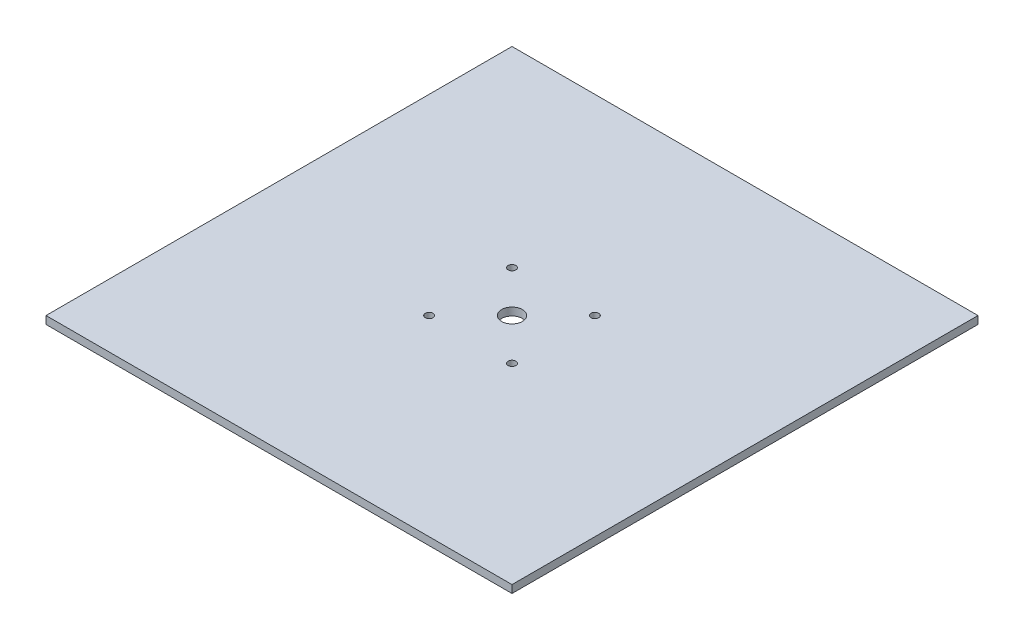
ISO-10303-21;
HEADER;
FILE_DESCRIPTION(('STEP AP214'),'2;1');
FILE_NAME('part.step','',(''),(''),'','','');
FILE_SCHEMA(('AUTOMOTIVE_DESIGN { 1 0 10303 214 1 1 1 1 }'));
ENDSEC;
DATA;
#1=APPLICATION_CONTEXT('core data for automotive mechanical design processes');
#2=APPLICATION_PROTOCOL_DEFINITION('international standard','automotive_design',2000,#1);
#3=PRODUCT_CONTEXT('',#1,'mechanical');
#4=PRODUCT('Part','Part','',(#3));
#5=PRODUCT_RELATED_PRODUCT_CATEGORY('part','',(#4));
#6=PRODUCT_DEFINITION_FORMATION('','',#4);
#7=PRODUCT_DEFINITION_CONTEXT('part definition',#1,'design');
#8=PRODUCT_DEFINITION('design','',#6,#7);
#9=PRODUCT_DEFINITION_SHAPE('','',#8);
#10=(LENGTH_UNIT() NAMED_UNIT(*) SI_UNIT(.MILLI.,.METRE.));
#11=(NAMED_UNIT(*) PLANE_ANGLE_UNIT() SI_UNIT($,.RADIAN.));
#12=(NAMED_UNIT(*) SI_UNIT($,.STERADIAN.) SOLID_ANGLE_UNIT());
#13=UNCERTAINTY_MEASURE_WITH_UNIT(LENGTH_MEASURE(1.E-05),#10,'distance_accuracy_value','');
#14=(GEOMETRIC_REPRESENTATION_CONTEXT(3) GLOBAL_UNCERTAINTY_ASSIGNED_CONTEXT((#13)) GLOBAL_UNIT_ASSIGNED_CONTEXT((#10,
#11,#12)) REPRESENTATION_CONTEXT('',''));
#15=CARTESIAN_POINT('',(0.,0.,0.));
#16=DIRECTION('',(0.,0.,1.));
#17=DIRECTION('',(1.,0.,0.));
#18=AXIS2_PLACEMENT_3D('',#15,#16,#17);
#19=CARTESIAN_POINT('',(90.,3.,90.));
#20=DIRECTION('',(-1.,0.,0.));
#21=DIRECTION('',(0.,0.,1.));
#22=AXIS2_PLACEMENT_3D('',#19,#20,#21);
#23=PLANE('',#22);
#24=DIRECTION('',(0.,0.,-1.));
#25=VECTOR('',#24,1.);
#26=CARTESIAN_POINT('',(90.,0.,90.));
#27=LINE('',#26,#25);
#28=CARTESIAN_POINT('',(90.,0.,90.));
#29=VERTEX_POINT('',#28);
#30=CARTESIAN_POINT('',(90.,0.,-90.));
#31=VERTEX_POINT('',#30);
#32=EDGE_CURVE('E107',#29,#31,#27,.T.);
#33=ORIENTED_EDGE('',*,*,#32,.T.);
#34=DIRECTION('',(0.,-1.,0.));
#35=VECTOR('',#34,1.);
#36=CARTESIAN_POINT('',(90.,3.,-90.));
#37=LINE('',#36,#35);
#38=CARTESIAN_POINT('',(90.,3.,-90.));
#39=VERTEX_POINT('',#38);
#40=EDGE_CURVE('E11',#39,#31,#37,.T.);
#41=ORIENTED_EDGE('',*,*,#40,.F.);
#42=DIRECTION('',(0.,0.,-1.));
#43=VECTOR('',#42,1.);
#44=CARTESIAN_POINT('',(90.,3.,90.));
#45=LINE('',#44,#43);
#46=CARTESIAN_POINT('',(90.,3.,90.));
#47=VERTEX_POINT('',#46);
#48=EDGE_CURVE('E91',#47,#39,#45,.T.);
#49=ORIENTED_EDGE('',*,*,#48,.F.);
#50=DIRECTION('',(0.,-1.,0.));
#51=VECTOR('',#50,1.);
#52=CARTESIAN_POINT('',(90.,3.,90.));
#53=LINE('',#52,#51);
#54=EDGE_CURVE('E103',#47,#29,#53,.T.);
#55=ORIENTED_EDGE('',*,*,#54,.T.);
#56=EDGE_LOOP('',(#33,#41,#49,#55));
#57=FACE_BOUND('',#56,.T.);
#58=ADVANCED_FACE('F39',(#57),#23,.F.);
#59=CARTESIAN_POINT('',(-90.,3.,-90.));
#60=DIRECTION('',(0.,0.,1.));
#61=DIRECTION('',(1.,0.,0.));
#62=AXIS2_PLACEMENT_3D('',#59,#60,#61);
#63=PLANE('',#62);
#64=DIRECTION('',(-1.,0.,0.));
#65=VECTOR('',#64,1.);
#66=CARTESIAN_POINT('',(-90.,0.,-90.));
#67=LINE('',#66,#65);
#68=CARTESIAN_POINT('',(-90.,0.,-90.));
#69=VERTEX_POINT('',#68);
#70=EDGE_CURVE('E96',#31,#69,#67,.T.);
#71=ORIENTED_EDGE('',*,*,#70,.T.);
#72=DIRECTION('',(0.,-1.,0.));
#73=VECTOR('',#72,1.);
#74=CARTESIAN_POINT('',(-90.,3.,-90.));
#75=LINE('',#74,#73);
#76=CARTESIAN_POINT('',(-90.,3.,-90.));
#77=VERTEX_POINT('',#76);
#78=EDGE_CURVE('E48',#77,#69,#75,.T.);
#79=ORIENTED_EDGE('',*,*,#78,.F.);
#80=DIRECTION('',(-1.,0.,0.));
#81=VECTOR('',#80,1.);
#82=CARTESIAN_POINT('',(-90.,3.,-90.));
#83=LINE('',#82,#81);
#84=EDGE_CURVE('E86',#39,#77,#83,.T.);
#85=ORIENTED_EDGE('',*,*,#84,.F.);
#86=ORIENTED_EDGE('',*,*,#40,.T.);
#87=EDGE_LOOP('',(#71,#79,#85,#86));
#88=FACE_BOUND('',#87,.T.);
#89=ADVANCED_FACE('F95',(#88),#63,.F.);
#90=CARTESIAN_POINT('',(-90.,3.,90.));
#91=DIRECTION('',(1.,0.,0.));
#92=DIRECTION('',(0.,0.,-1.));
#93=AXIS2_PLACEMENT_3D('',#90,#91,#92);
#94=PLANE('',#93);
#95=DIRECTION('',(0.,0.,1.));
#96=VECTOR('',#95,1.);
#97=CARTESIAN_POINT('',(-90.,0.,90.));
#98=LINE('',#97,#96);
#99=CARTESIAN_POINT('',(-90.,0.,90.));
#100=VERTEX_POINT('',#99);
#101=EDGE_CURVE('E73',#69,#100,#98,.T.);
#102=ORIENTED_EDGE('',*,*,#101,.T.);
#103=DIRECTION('',(0.,-1.,0.));
#104=VECTOR('',#103,1.);
#105=CARTESIAN_POINT('',(-90.,3.,90.));
#106=LINE('',#105,#104);
#107=CARTESIAN_POINT('',(-90.,3.,90.));
#108=VERTEX_POINT('',#107);
#109=EDGE_CURVE('E98',#108,#100,#106,.T.);
#110=ORIENTED_EDGE('',*,*,#109,.F.);
#111=DIRECTION('',(0.,0.,1.));
#112=VECTOR('',#111,1.);
#113=CARTESIAN_POINT('',(-90.,3.,90.));
#114=LINE('',#113,#112);
#115=EDGE_CURVE('E89',#77,#108,#114,.T.);
#116=ORIENTED_EDGE('',*,*,#115,.F.);
#117=ORIENTED_EDGE('',*,*,#78,.T.);
#118=EDGE_LOOP('',(#102,#110,#116,#117));
#119=FACE_BOUND('',#118,.T.);
#120=ADVANCED_FACE('F99',(#119),#94,.F.);
#121=CARTESIAN_POINT('',(-90.,3.,90.));
#122=DIRECTION('',(0.,0.,-1.));
#123=DIRECTION('',(-1.,0.,0.));
#124=AXIS2_PLACEMENT_3D('',#121,#122,#123);
#125=PLANE('',#124);
#126=DIRECTION('',(1.,0.,0.));
#127=VECTOR('',#126,1.);
#128=CARTESIAN_POINT('',(-90.,0.,90.));
#129=LINE('',#128,#127);
#130=EDGE_CURVE('E79',#100,#29,#129,.T.);
#131=ORIENTED_EDGE('',*,*,#130,.T.);
#132=ORIENTED_EDGE('',*,*,#54,.F.);
#133=DIRECTION('',(1.,0.,0.));
#134=VECTOR('',#133,1.);
#135=CARTESIAN_POINT('',(-90.,3.,90.));
#136=LINE('',#135,#134);
#137=EDGE_CURVE('E56',#108,#47,#136,.T.);
#138=ORIENTED_EDGE('',*,*,#137,.F.);
#139=ORIENTED_EDGE('',*,*,#109,.T.);
#140=EDGE_LOOP('',(#131,#132,#138,#139));
#141=FACE_BOUND('',#140,.T.);
#142=ADVANCED_FACE('F121',(#141),#125,.F.);
#143=CARTESIAN_POINT('',(0.,3.,0.));
#144=DIRECTION('',(0.,-1.,0.));
#145=DIRECTION('',(0.,0.,-1.));
#146=AXIS2_PLACEMENT_3D('',#143,#144,#145);
#147=PLANE('',#146);
#148=CARTESIAN_POINT('',(-15.9999999999991,3.,16.));
#149=DIRECTION('',(0.,-1.,0.));
#150=DIRECTION('',(0.,0.,-1.));
#151=AXIS2_PLACEMENT_3D('',#148,#149,#150);
#152=CIRCLE('',#151,1.50000000000047);
#153=CARTESIAN_POINT('',(-15.9999999999991,3.,14.4999999999995));
#154=VERTEX_POINT('',#153);
#155=EDGE_CURVE('E111',#154,#154,#152,.T.);
#156=ORIENTED_EDGE('',*,*,#155,.T.);
#157=EDGE_LOOP('',(#156));
#158=FACE_BOUND('',#157,.T.);
#159=CARTESIAN_POINT('',(16.0000000000009,3.,15.9999999999991));
#160=DIRECTION('',(0.,-1.,0.));
#161=DIRECTION('',(0.,0.,-1.));
#162=AXIS2_PLACEMENT_3D('',#159,#160,#161);
#163=CIRCLE('',#162,1.50000000000126);
#164=CARTESIAN_POINT('',(16.0000000000009,3.,14.4999999999978));
#165=VERTEX_POINT('',#164);
#166=EDGE_CURVE('E131',#165,#165,#163,.T.);
#167=ORIENTED_EDGE('',*,*,#166,.T.);
#168=EDGE_LOOP('',(#167));
#169=FACE_BOUND('',#168,.T.);
#170=CARTESIAN_POINT('',(16.,3.,-16.0000000000009));
#171=DIRECTION('',(0.,-1.,0.));
#172=DIRECTION('',(0.,0.,-1.));
#173=AXIS2_PLACEMENT_3D('',#170,#171,#172);
#174=CIRCLE('',#173,1.50000000000093);
#175=CARTESIAN_POINT('',(16.,3.,-17.5000000000018));
#176=VERTEX_POINT('',#175);
#177=EDGE_CURVE('E135',#176,#176,#174,.T.);
#178=ORIENTED_EDGE('',*,*,#177,.T.);
#179=EDGE_LOOP('',(#178));
#180=FACE_BOUND('',#179,.T.);
#181=CARTESIAN_POINT('',(-16.,3.,-16.));
#182=DIRECTION('',(0.,-1.,0.));
#183=DIRECTION('',(0.,0.,-1.));
#184=AXIS2_PLACEMENT_3D('',#181,#182,#183);
#185=CIRCLE('',#184,1.5);
#186=CARTESIAN_POINT('',(-16.,3.,-17.5));
#187=VERTEX_POINT('',#186);
#188=EDGE_CURVE('E139',#187,#187,#185,.T.);
#189=ORIENTED_EDGE('',*,*,#188,.T.);
#190=EDGE_LOOP('',(#189));
#191=FACE_BOUND('',#190,.T.);
#192=CARTESIAN_POINT('',(0.,3.,0.));
#193=DIRECTION('',(0.,-1.,0.));
#194=DIRECTION('',(0.,0.,-1.));
#195=AXIS2_PLACEMENT_3D('',#192,#193,#194);
#196=CIRCLE('',#195,4.);
#197=CARTESIAN_POINT('',(0.,3.,-4.));
#198=VERTEX_POINT('',#197);
#199=EDGE_CURVE('E143',#198,#198,#196,.T.);
#200=ORIENTED_EDGE('',*,*,#199,.T.);
#201=EDGE_LOOP('',(#200));
#202=FACE_BOUND('',#201,.T.);
#203=ORIENTED_EDGE('',*,*,#48,.T.);
#204=ORIENTED_EDGE('',*,*,#84,.T.);
#205=ORIENTED_EDGE('',*,*,#115,.T.);
#206=ORIENTED_EDGE('',*,*,#137,.T.);
#207=EDGE_LOOP('',(#203,#204,#205,#206));
#208=FACE_BOUND('',#207,.T.);
#209=ADVANCED_FACE('F87',(#158,#169,#180,#191,#202,#208),#147,.F.);
#210=CARTESIAN_POINT('',(0.,0.,0.));
#211=DIRECTION('',(0.,-1.,0.));
#212=DIRECTION('',(0.,0.,-1.));
#213=AXIS2_PLACEMENT_3D('',#210,#211,#212);
#214=PLANE('',#213);
#215=CARTESIAN_POINT('',(-15.9999999999991,0.,16.));
#216=DIRECTION('',(0.,1.,0.));
#217=DIRECTION('',(0.,0.,1.));
#218=AXIS2_PLACEMENT_3D('',#215,#216,#217);
#219=CIRCLE('',#218,1.50000000000047);
#220=CARTESIAN_POINT('',(-15.9999999999991,0.,17.5000000000005));
#221=VERTEX_POINT('',#220);
#222=EDGE_CURVE('E152',#221,#221,#219,.T.);
#223=ORIENTED_EDGE('',*,*,#222,.T.);
#224=EDGE_LOOP('',(#223));
#225=FACE_BOUND('',#224,.T.);
#226=CARTESIAN_POINT('',(16.0000000000009,0.,15.9999999999991));
#227=DIRECTION('',(0.,1.,0.));
#228=DIRECTION('',(0.,0.,1.));
#229=AXIS2_PLACEMENT_3D('',#226,#227,#228);
#230=CIRCLE('',#229,1.50000000000126);
#231=CARTESIAN_POINT('',(16.0000000000009,0.,17.5000000000004));
#232=VERTEX_POINT('',#231);
#233=EDGE_CURVE('E156',#232,#232,#230,.T.);
#234=ORIENTED_EDGE('',*,*,#233,.T.);
#235=EDGE_LOOP('',(#234));
#236=FACE_BOUND('',#235,.T.);
#237=CARTESIAN_POINT('',(16.,0.,-16.0000000000009));
#238=DIRECTION('',(0.,1.,0.));
#239=DIRECTION('',(0.,0.,1.));
#240=AXIS2_PLACEMENT_3D('',#237,#238,#239);
#241=CIRCLE('',#240,1.50000000000093);
#242=CARTESIAN_POINT('',(16.,0.,-14.5));
#243=VERTEX_POINT('',#242);
#244=EDGE_CURVE('E160',#243,#243,#241,.T.);
#245=ORIENTED_EDGE('',*,*,#244,.T.);
#246=EDGE_LOOP('',(#245));
#247=FACE_BOUND('',#246,.T.);
#248=CARTESIAN_POINT('',(-16.,0.,-16.));
#249=DIRECTION('',(0.,1.,0.));
#250=DIRECTION('',(0.,0.,1.));
#251=AXIS2_PLACEMENT_3D('',#248,#249,#250);
#252=CIRCLE('',#251,1.5);
#253=CARTESIAN_POINT('',(-16.,0.,-14.5));
#254=VERTEX_POINT('',#253);
#255=EDGE_CURVE('E151',#254,#254,#252,.T.);
#256=ORIENTED_EDGE('',*,*,#255,.T.);
#257=EDGE_LOOP('',(#256));
#258=FACE_BOUND('',#257,.T.);
#259=CARTESIAN_POINT('',(0.,0.,0.));
#260=DIRECTION('',(0.,1.,0.));
#261=DIRECTION('',(0.,0.,1.));
#262=AXIS2_PLACEMENT_3D('',#259,#260,#261);
#263=CIRCLE('',#262,4.);
#264=CARTESIAN_POINT('',(0.,0.,4.));
#265=VERTEX_POINT('',#264);
#266=EDGE_CURVE('E147',#265,#265,#263,.T.);
#267=ORIENTED_EDGE('',*,*,#266,.T.);
#268=EDGE_LOOP('',(#267));
#269=FACE_BOUND('',#268,.T.);
#270=ORIENTED_EDGE('',*,*,#32,.F.);
#271=ORIENTED_EDGE('',*,*,#130,.F.);
#272=ORIENTED_EDGE('',*,*,#101,.F.);
#273=ORIENTED_EDGE('',*,*,#70,.F.);
#274=EDGE_LOOP('',(#270,#271,#272,#273));
#275=FACE_BOUND('',#274,.T.);
#276=ADVANCED_FACE('F124',(#225,#236,#247,#258,#269,#275),#214,.T.);
#277=CARTESIAN_POINT('',(0.,0.,0.));
#278=DIRECTION('',(0.,1.,0.));
#279=DIRECTION('',(0.,0.,1.));
#280=AXIS2_PLACEMENT_3D('',#277,#278,#279);
#281=CYLINDRICAL_SURFACE('',#280,4.);
#282=ORIENTED_EDGE('',*,*,#266,.F.);
#283=EDGE_LOOP('',(#282));
#284=FACE_BOUND('',#283,.T.);
#285=ORIENTED_EDGE('',*,*,#199,.F.);
#286=EDGE_LOOP('',(#285));
#287=FACE_BOUND('',#286,.T.);
#288=ADVANCED_FACE('F174',(#284,#287),#281,.F.);
#289=CARTESIAN_POINT('',(-16.,0.,-16.));
#290=DIRECTION('',(0.,1.,0.));
#291=DIRECTION('',(0.,0.,1.));
#292=AXIS2_PLACEMENT_3D('',#289,#290,#291);
#293=CYLINDRICAL_SURFACE('',#292,1.5);
#294=ORIENTED_EDGE('',*,*,#255,.F.);
#295=EDGE_LOOP('',(#294));
#296=FACE_BOUND('',#295,.T.);
#297=ORIENTED_EDGE('',*,*,#188,.F.);
#298=EDGE_LOOP('',(#297));
#299=FACE_BOUND('',#298,.T.);
#300=ADVANCED_FACE('F170',(#296,#299),#293,.F.);
#301=CARTESIAN_POINT('',(16.,0.,-16.0000000000009));
#302=DIRECTION('',(0.,1.,0.));
#303=DIRECTION('',(0.,0.,1.));
#304=AXIS2_PLACEMENT_3D('',#301,#302,#303);
#305=CYLINDRICAL_SURFACE('',#304,1.50000000000093);
#306=ORIENTED_EDGE('',*,*,#244,.F.);
#307=EDGE_LOOP('',(#306));
#308=FACE_BOUND('',#307,.T.);
#309=ORIENTED_EDGE('',*,*,#177,.F.);
#310=EDGE_LOOP('',(#309));
#311=FACE_BOUND('',#310,.T.);
#312=ADVANCED_FACE('F173',(#308,#311),#305,.F.);
#313=CARTESIAN_POINT('',(16.0000000000009,0.,15.9999999999991));
#314=DIRECTION('',(0.,1.,0.));
#315=DIRECTION('',(0.,0.,1.));
#316=AXIS2_PLACEMENT_3D('',#313,#314,#315);
#317=CYLINDRICAL_SURFACE('',#316,1.50000000000126);
#318=ORIENTED_EDGE('',*,*,#233,.F.);
#319=EDGE_LOOP('',(#318));
#320=FACE_BOUND('',#319,.T.);
#321=ORIENTED_EDGE('',*,*,#166,.F.);
#322=EDGE_LOOP('',(#321));
#323=FACE_BOUND('',#322,.T.);
#324=ADVANCED_FACE('F235',(#320,#323),#317,.F.);
#325=CARTESIAN_POINT('',(-15.9999999999991,0.,16.));
#326=DIRECTION('',(0.,1.,0.));
#327=DIRECTION('',(0.,0.,1.));
#328=AXIS2_PLACEMENT_3D('',#325,#326,#327);
#329=CYLINDRICAL_SURFACE('',#328,1.50000000000047);
#330=ORIENTED_EDGE('',*,*,#222,.F.);
#331=EDGE_LOOP('',(#330));
#332=FACE_BOUND('',#331,.T.);
#333=ORIENTED_EDGE('',*,*,#155,.F.);
#334=EDGE_LOOP('',(#333));
#335=FACE_BOUND('',#334,.T.);
#336=ADVANCED_FACE('F245',(#332,#335),#329,.F.);
#337=CLOSED_SHELL('',(#58,#89,#120,#142,#209,#276,#288,#300,#312,#324,#336));
#338=MANIFOLD_SOLID_BREP('B2',#337);
#339=ADVANCED_BREP_SHAPE_REPRESENTATION('',(#18,#338),#14);
#340=SHAPE_DEFINITION_REPRESENTATION(#9,#339);
ENDSEC;
END-ISO-10303-21;
